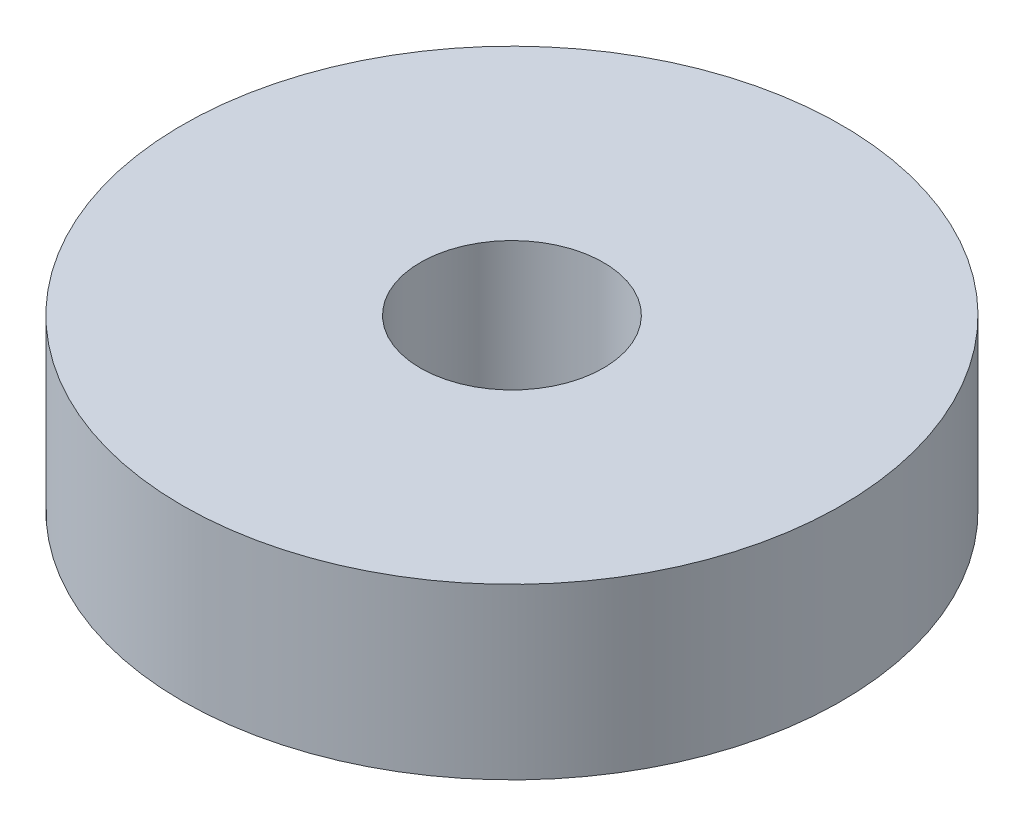
ISO-10303-21;
HEADER;
FILE_DESCRIPTION(('STEP AP214'),'2;1');
FILE_NAME('part.step','',(''),(''),'','','');
FILE_SCHEMA(('AUTOMOTIVE_DESIGN { 1 0 10303 214 1 1 1 1 }'));
ENDSEC;
DATA;
#1=APPLICATION_CONTEXT('core data for automotive mechanical design processes');
#2=APPLICATION_PROTOCOL_DEFINITION('international standard','automotive_design',2000,#1);
#3=PRODUCT_CONTEXT('',#1,'mechanical');
#4=PRODUCT('Part','Part','',(#3));
#5=PRODUCT_RELATED_PRODUCT_CATEGORY('part','',(#4));
#6=PRODUCT_DEFINITION_FORMATION('','',#4);
#7=PRODUCT_DEFINITION_CONTEXT('part definition',#1,'design');
#8=PRODUCT_DEFINITION('design','',#6,#7);
#9=PRODUCT_DEFINITION_SHAPE('','',#8);
#10=(LENGTH_UNIT() NAMED_UNIT(*) SI_UNIT(.MILLI.,.METRE.));
#11=(NAMED_UNIT(*) PLANE_ANGLE_UNIT() SI_UNIT($,.RADIAN.));
#12=(NAMED_UNIT(*) SI_UNIT($,.STERADIAN.) SOLID_ANGLE_UNIT());
#13=UNCERTAINTY_MEASURE_WITH_UNIT(LENGTH_MEASURE(1.E-05),#10,'distance_accuracy_value','');
#14=(GEOMETRIC_REPRESENTATION_CONTEXT(3) GLOBAL_UNCERTAINTY_ASSIGNED_CONTEXT((#13)) GLOBAL_UNIT_ASSIGNED_CONTEXT((#10,
#11,#12)) REPRESENTATION_CONTEXT('',''));
#15=CARTESIAN_POINT('',(0.,0.,0.));
#16=DIRECTION('',(0.,0.,1.));
#17=DIRECTION('',(1.,0.,0.));
#18=AXIS2_PLACEMENT_3D('',#15,#16,#17);
#19=CARTESIAN_POINT('',(0.,9.25,0.));
#20=DIRECTION('',(0.,1.,0.));
#21=DIRECTION('',(0.,0.,1.));
#22=AXIS2_PLACEMENT_3D('',#19,#20,#21);
#23=PLANE('',#22);
#24=CARTESIAN_POINT('',(0.,9.25,0.));
#25=DIRECTION('',(0.,1.,0.));
#26=DIRECTION('',(0.,0.,1.));
#27=AXIS2_PLACEMENT_3D('',#24,#25,#26);
#28=CIRCLE('',#27,18.);
#29=CARTESIAN_POINT('',(0.,9.25,18.));
#30=VERTEX_POINT('',#29);
#31=EDGE_CURVE('E10',#30,#30,#28,.T.);
#32=ORIENTED_EDGE('',*,*,#31,.T.);
#33=EDGE_LOOP('',(#32));
#34=FACE_BOUND('',#33,.T.);
#35=CARTESIAN_POINT('',(0.,9.25,0.));
#36=DIRECTION('',(0.,1.,0.));
#37=DIRECTION('',(0.,0.,1.));
#38=AXIS2_PLACEMENT_3D('',#35,#36,#37);
#39=CIRCLE('',#38,5.);
#40=CARTESIAN_POINT('',(0.,9.25,5.));
#41=VERTEX_POINT('',#40);
#42=EDGE_CURVE('E46',#41,#41,#39,.T.);
#43=ORIENTED_EDGE('',*,*,#42,.F.);
#44=EDGE_LOOP('',(#43));
#45=FACE_BOUND('',#44,.T.);
#46=ADVANCED_FACE('F35',(#34,#45),#23,.T.);
#47=CARTESIAN_POINT('',(0.,0.,0.));
#48=DIRECTION('',(0.,1.,0.));
#49=DIRECTION('',(0.,0.,1.));
#50=AXIS2_PLACEMENT_3D('',#47,#48,#49);
#51=PLANE('',#50);
#52=CARTESIAN_POINT('',(0.,0.,0.));
#53=DIRECTION('',(0.,1.,0.));
#54=DIRECTION('',(0.,0.,1.));
#55=AXIS2_PLACEMENT_3D('',#52,#53,#54);
#56=CIRCLE('',#55,18.);
#57=CARTESIAN_POINT('',(0.,0.,18.));
#58=VERTEX_POINT('',#57);
#59=EDGE_CURVE('E39',#58,#58,#56,.T.);
#60=ORIENTED_EDGE('',*,*,#59,.F.);
#61=EDGE_LOOP('',(#60));
#62=FACE_BOUND('',#61,.T.);
#63=CARTESIAN_POINT('',(0.,0.,0.));
#64=DIRECTION('',(0.,1.,0.));
#65=DIRECTION('',(0.,0.,1.));
#66=AXIS2_PLACEMENT_3D('',#63,#64,#65);
#67=CIRCLE('',#66,5.);
#68=CARTESIAN_POINT('',(0.,0.,5.));
#69=VERTEX_POINT('',#68);
#70=EDGE_CURVE('E48',#69,#69,#67,.T.);
#71=ORIENTED_EDGE('',*,*,#70,.T.);
#72=EDGE_LOOP('',(#71));
#73=FACE_BOUND('',#72,.T.);
#74=ADVANCED_FACE('F58',(#62,#73),#51,.F.);
#75=CARTESIAN_POINT('',(0.,9.25,0.));
#76=DIRECTION('',(0.,-1.,0.));
#77=DIRECTION('',(0.,0.,-1.));
#78=AXIS2_PLACEMENT_3D('',#75,#76,#77);
#79=CYLINDRICAL_SURFACE('',#78,18.);
#80=ORIENTED_EDGE('',*,*,#31,.F.);
#81=EDGE_LOOP('',(#80));
#82=FACE_BOUND('',#81,.T.);
#83=ORIENTED_EDGE('',*,*,#59,.T.);
#84=EDGE_LOOP('',(#83));
#85=FACE_BOUND('',#84,.T.);
#86=ADVANCED_FACE('F37',(#82,#85),#79,.T.);
#87=CARTESIAN_POINT('',(0.,9.25,0.));
#88=DIRECTION('',(0.,-1.,0.));
#89=DIRECTION('',(0.,0.,-1.));
#90=AXIS2_PLACEMENT_3D('',#87,#88,#89);
#91=CYLINDRICAL_SURFACE('',#90,5.);
#92=ORIENTED_EDGE('',*,*,#42,.T.);
#93=EDGE_LOOP('',(#92));
#94=FACE_BOUND('',#93,.T.);
#95=ORIENTED_EDGE('',*,*,#70,.F.);
#96=EDGE_LOOP('',(#95));
#97=FACE_BOUND('',#96,.T.);
#98=ADVANCED_FACE('F54',(#94,#97),#91,.F.);
#99=CLOSED_SHELL('',(#46,#74,#86,#98));
#100=MANIFOLD_SOLID_BREP('B2',#99);
#101=ADVANCED_BREP_SHAPE_REPRESENTATION('',(#18,#100),#14);
#102=SHAPE_DEFINITION_REPRESENTATION(#9,#101);
ENDSEC;
END-ISO-10303-21;
